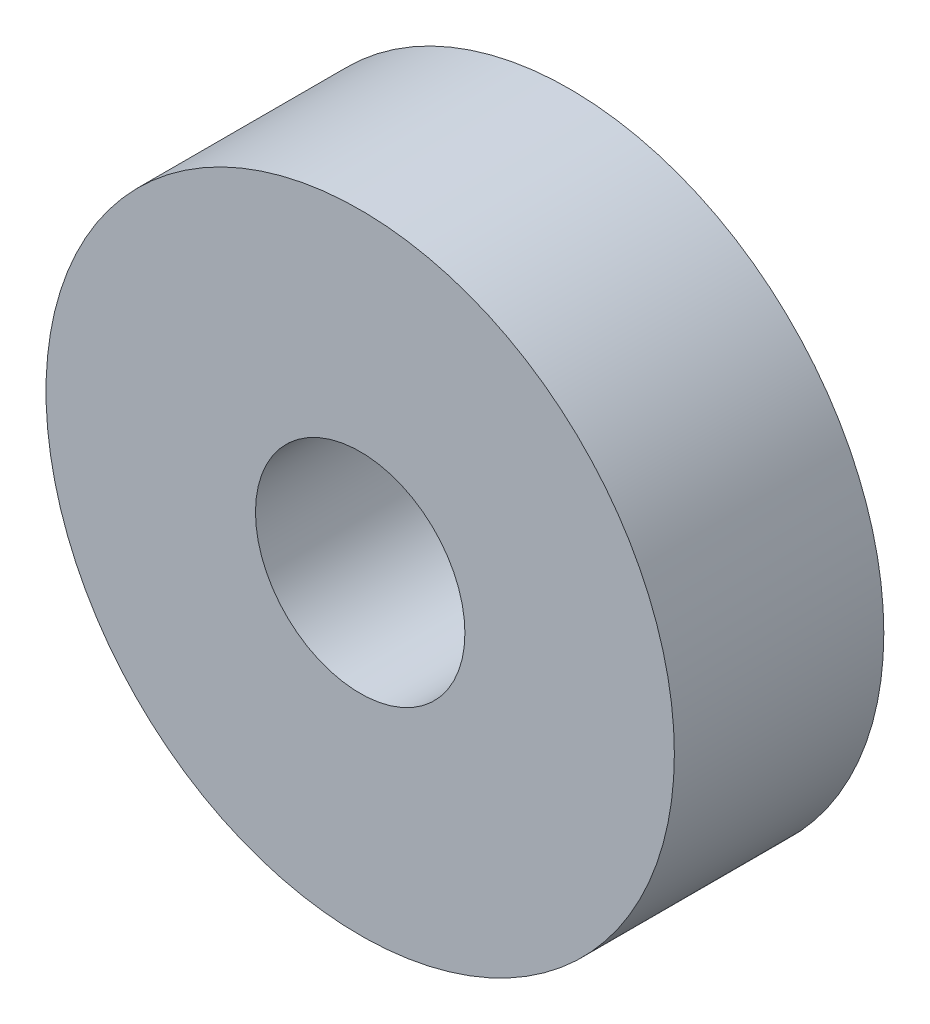
ISO-10303-21;
HEADER;
FILE_DESCRIPTION(('STEP AP214'),'2;1');
FILE_NAME('part.step','',(''),(''),'','','');
FILE_SCHEMA(('AUTOMOTIVE_DESIGN { 1 0 10303 214 1 1 1 1 }'));
ENDSEC;
DATA;
#1=APPLICATION_CONTEXT('core data for automotive mechanical design processes');
#2=APPLICATION_PROTOCOL_DEFINITION('international standard','automotive_design',2000,#1);
#3=PRODUCT_CONTEXT('',#1,'mechanical');
#4=PRODUCT('Part','Part','',(#3));
#5=PRODUCT_RELATED_PRODUCT_CATEGORY('part','',(#4));
#6=PRODUCT_DEFINITION_FORMATION('','',#4);
#7=PRODUCT_DEFINITION_CONTEXT('part definition',#1,'design');
#8=PRODUCT_DEFINITION('design','',#6,#7);
#9=PRODUCT_DEFINITION_SHAPE('','',#8);
#10=(LENGTH_UNIT() NAMED_UNIT(*) SI_UNIT(.MILLI.,.METRE.));
#11=(NAMED_UNIT(*) PLANE_ANGLE_UNIT() SI_UNIT($,.RADIAN.));
#12=(NAMED_UNIT(*) SI_UNIT($,.STERADIAN.) SOLID_ANGLE_UNIT());
#13=UNCERTAINTY_MEASURE_WITH_UNIT(LENGTH_MEASURE(1.E-05),#10,'distance_accuracy_value','');
#14=(GEOMETRIC_REPRESENTATION_CONTEXT(3) GLOBAL_UNCERTAINTY_ASSIGNED_CONTEXT((#13)) GLOBAL_UNIT_ASSIGNED_CONTEXT((#10,
#11,#12)) REPRESENTATION_CONTEXT('',''));
#15=CARTESIAN_POINT('',(0.,0.,0.));
#16=DIRECTION('',(0.,0.,1.));
#17=DIRECTION('',(1.,0.,0.));
#18=AXIS2_PLACEMENT_3D('',#15,#16,#17);
#19=CARTESIAN_POINT('',(0.,0.,2.));
#20=DIRECTION('',(0.,0.,1.));
#21=DIRECTION('',(1.,0.,0.));
#22=AXIS2_PLACEMENT_3D('',#19,#20,#21);
#23=PLANE('',#22);
#24=CARTESIAN_POINT('',(0.,0.,2.));
#25=DIRECTION('',(0.,0.,1.));
#26=DIRECTION('',(1.,0.,0.));
#27=AXIS2_PLACEMENT_3D('',#24,#25,#26);
#28=CIRCLE('',#27,6.);
#29=CARTESIAN_POINT('',(6.,0.,2.));
#30=VERTEX_POINT('',#29);
#31=EDGE_CURVE('E10',#30,#30,#28,.T.);
#32=ORIENTED_EDGE('',*,*,#31,.T.);
#33=EDGE_LOOP('',(#32));
#34=FACE_BOUND('',#33,.T.);
#35=CARTESIAN_POINT('',(0.,0.,2.));
#36=DIRECTION('',(0.,0.,1.));
#37=DIRECTION('',(1.,0.,0.));
#38=AXIS2_PLACEMENT_3D('',#35,#36,#37);
#39=CIRCLE('',#38,2.);
#40=CARTESIAN_POINT('',(2.,0.,2.));
#41=VERTEX_POINT('',#40);
#42=EDGE_CURVE('E56',#41,#41,#39,.T.);
#43=ORIENTED_EDGE('',*,*,#42,.F.);
#44=EDGE_LOOP('',(#43));
#45=FACE_BOUND('',#44,.T.);
#46=ADVANCED_FACE('F43',(#34,#45),#23,.T.);
#47=CARTESIAN_POINT('',(0.,0.,-2.));
#48=DIRECTION('',(0.,0.,1.));
#49=DIRECTION('',(1.,0.,0.));
#50=AXIS2_PLACEMENT_3D('',#47,#48,#49);
#51=PLANE('',#50);
#52=CARTESIAN_POINT('',(0.,0.,-2.));
#53=DIRECTION('',(0.,0.,1.));
#54=DIRECTION('',(1.,0.,0.));
#55=AXIS2_PLACEMENT_3D('',#52,#53,#54);
#56=CIRCLE('',#55,6.);
#57=CARTESIAN_POINT('',(6.,0.,-2.));
#58=VERTEX_POINT('',#57);
#59=EDGE_CURVE('E47',#58,#58,#56,.T.);
#60=ORIENTED_EDGE('',*,*,#59,.F.);
#61=EDGE_LOOP('',(#60));
#62=FACE_BOUND('',#61,.T.);
#63=CARTESIAN_POINT('',(0.,0.,-2.));
#64=DIRECTION('',(0.,0.,1.));
#65=DIRECTION('',(1.,0.,0.));
#66=AXIS2_PLACEMENT_3D('',#63,#64,#65);
#67=CIRCLE('',#66,2.);
#68=CARTESIAN_POINT('',(2.,0.,-2.));
#69=VERTEX_POINT('',#68);
#70=EDGE_CURVE('E58',#69,#69,#67,.T.);
#71=ORIENTED_EDGE('',*,*,#70,.T.);
#72=EDGE_LOOP('',(#71));
#73=FACE_BOUND('',#72,.T.);
#74=ADVANCED_FACE('F70',(#62,#73),#51,.F.);
#75=CARTESIAN_POINT('',(0.,0.,2.));
#76=DIRECTION('',(0.,0.,-1.));
#77=DIRECTION('',(-1.,0.,0.));
#78=AXIS2_PLACEMENT_3D('',#75,#76,#77);
#79=CYLINDRICAL_SURFACE('',#78,6.);
#80=ORIENTED_EDGE('',*,*,#31,.F.);
#81=EDGE_LOOP('',(#80));
#82=FACE_BOUND('',#81,.T.);
#83=ORIENTED_EDGE('',*,*,#59,.T.);
#84=EDGE_LOOP('',(#83));
#85=FACE_BOUND('',#84,.T.);
#86=ADVANCED_FACE('F45',(#82,#85),#79,.T.);
#87=CARTESIAN_POINT('',(0.,0.,2.));
#88=DIRECTION('',(0.,0.,-1.));
#89=DIRECTION('',(-1.,0.,0.));
#90=AXIS2_PLACEMENT_3D('',#87,#88,#89);
#91=CYLINDRICAL_SURFACE('',#90,2.);
#92=ORIENTED_EDGE('',*,*,#42,.T.);
#93=EDGE_LOOP('',(#92));
#94=FACE_BOUND('',#93,.T.);
#95=ORIENTED_EDGE('',*,*,#70,.F.);
#96=EDGE_LOOP('',(#95));
#97=FACE_BOUND('',#96,.T.);
#98=ADVANCED_FACE('F66',(#94,#97),#91,.F.);
#99=CLOSED_SHELL('',(#46,#74,#86,#98));
#100=MANIFOLD_SOLID_BREP('B2',#99);
#101=ADVANCED_BREP_SHAPE_REPRESENTATION('',(#18,#100),#14);
#102=SHAPE_DEFINITION_REPRESENTATION(#9,#101);
ENDSEC;
END-ISO-10303-21;
